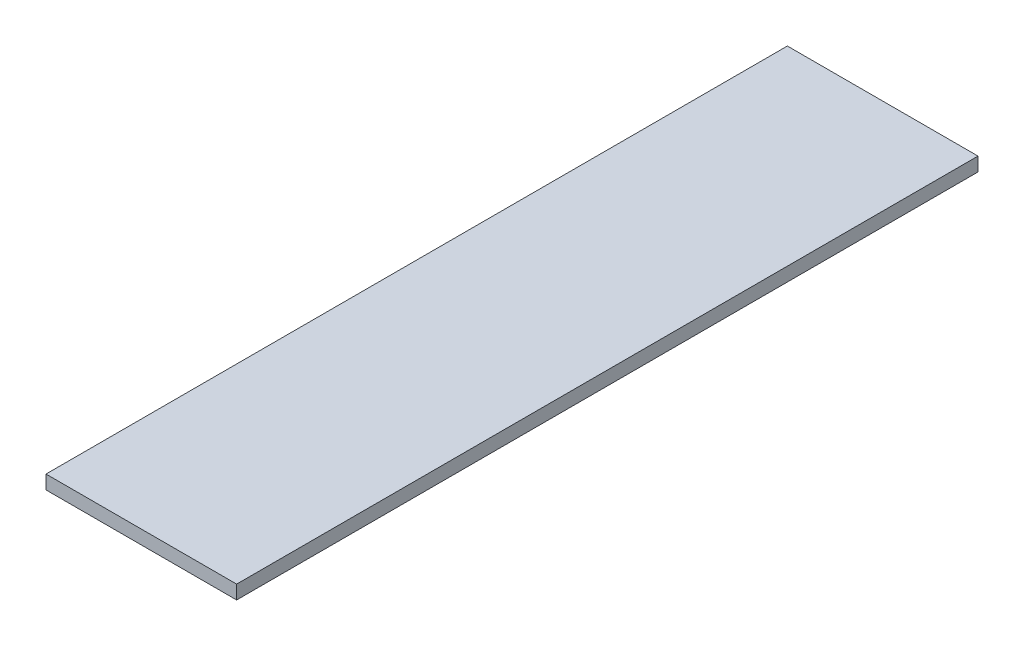
ISO-10303-21;
HEADER;
FILE_DESCRIPTION(('STEP AP214'),'2;1');
FILE_NAME('part.step','',(''),(''),'','','');
FILE_SCHEMA(('AUTOMOTIVE_DESIGN { 1 0 10303 214 1 1 1 1 }'));
ENDSEC;
DATA;
#1=APPLICATION_CONTEXT('core data for automotive mechanical design processes');
#2=APPLICATION_PROTOCOL_DEFINITION('international standard','automotive_design',2000,#1);
#3=PRODUCT_CONTEXT('',#1,'mechanical');
#4=PRODUCT('Part','Part','',(#3));
#5=PRODUCT_RELATED_PRODUCT_CATEGORY('part','',(#4));
#6=PRODUCT_DEFINITION_FORMATION('','',#4);
#7=PRODUCT_DEFINITION_CONTEXT('part definition',#1,'design');
#8=PRODUCT_DEFINITION('design','',#6,#7);
#9=PRODUCT_DEFINITION_SHAPE('','',#8);
#10=(LENGTH_UNIT() NAMED_UNIT(*) SI_UNIT(.MILLI.,.METRE.));
#11=(NAMED_UNIT(*) PLANE_ANGLE_UNIT() SI_UNIT($,.RADIAN.));
#12=(NAMED_UNIT(*) SI_UNIT($,.STERADIAN.) SOLID_ANGLE_UNIT());
#13=UNCERTAINTY_MEASURE_WITH_UNIT(LENGTH_MEASURE(1.E-05),#10,'distance_accuracy_value','');
#14=(GEOMETRIC_REPRESENTATION_CONTEXT(3) GLOBAL_UNCERTAINTY_ASSIGNED_CONTEXT((#13)) GLOBAL_UNIT_ASSIGNED_CONTEXT((#10,
#11,#12)) REPRESENTATION_CONTEXT('',''));
#15=CARTESIAN_POINT('',(0.,0.,0.));
#16=DIRECTION('',(0.,0.,1.));
#17=DIRECTION('',(1.,0.,0.));
#18=AXIS2_PLACEMENT_3D('',#15,#16,#17);
#19=CARTESIAN_POINT('',(-61.5441969952535,28.8120922238926,700.));
#20=DIRECTION('',(1.,0.,0.));
#21=DIRECTION('',(0.,1.,0.));
#22=AXIS2_PLACEMENT_3D('',#19,#20,#21);
#23=PLANE('',#22);
#24=DIRECTION('',(0.,-1.,0.));
#25=VECTOR('',#24,1.);
#26=CARTESIAN_POINT('',(-61.5441969952535,28.8120922238926,0.));
#27=LINE('',#26,#25);
#28=CARTESIAN_POINT('',(-61.5441969952535,28.8120922238926,0.));
#29=VERTEX_POINT('',#28);
#30=CARTESIAN_POINT('',(-61.5441969952535,15.8120922238926,0.));
#31=VERTEX_POINT('',#30);
#32=EDGE_CURVE('E96',#29,#31,#27,.T.);
#33=ORIENTED_EDGE('',*,*,#32,.T.);
#34=DIRECTION('',(0.,0.,-1.));
#35=VECTOR('',#34,1.);
#36=CARTESIAN_POINT('',(-61.5441969952535,15.8120922238926,700.));
#37=LINE('',#36,#35);
#38=CARTESIAN_POINT('',(-61.5441969952535,15.8120922238926,700.));
#39=VERTEX_POINT('',#38);
#40=EDGE_CURVE('E11',#39,#31,#37,.T.);
#41=ORIENTED_EDGE('',*,*,#40,.F.);
#42=DIRECTION('',(0.,-1.,0.));
#43=VECTOR('',#42,1.);
#44=CARTESIAN_POINT('',(-61.5441969952535,28.8120922238926,700.));
#45=LINE('',#44,#43);
#46=CARTESIAN_POINT('',(-61.5441969952535,28.8120922238926,700.));
#47=VERTEX_POINT('',#46);
#48=EDGE_CURVE('E84',#47,#39,#45,.T.);
#49=ORIENTED_EDGE('',*,*,#48,.F.);
#50=DIRECTION('',(0.,0.,-1.));
#51=VECTOR('',#50,1.);
#52=CARTESIAN_POINT('',(-61.5441969952535,28.8120922238926,700.));
#53=LINE('',#52,#51);
#54=EDGE_CURVE('E92',#47,#29,#53,.T.);
#55=ORIENTED_EDGE('',*,*,#54,.T.);
#56=EDGE_LOOP('',(#33,#41,#49,#55));
#57=FACE_BOUND('',#56,.T.);
#58=ADVANCED_FACE('F33',(#57),#23,.F.);
#59=CARTESIAN_POINT('',(-61.5441969952535,15.8120922238926,700.));
#60=DIRECTION('',(0.,1.,0.));
#61=DIRECTION('',(0.,0.,1.));
#62=AXIS2_PLACEMENT_3D('',#59,#60,#61);
#63=PLANE('',#62);
#64=DIRECTION('',(1.,0.,0.));
#65=VECTOR('',#64,1.);
#66=CARTESIAN_POINT('',(-61.5441969952535,15.8120922238926,0.));
#67=LINE('',#66,#65);
#68=CARTESIAN_POINT('',(118.455803004747,15.8120922238926,0.));
#69=VERTEX_POINT('',#68);
#70=EDGE_CURVE('E88',#31,#69,#67,.T.);
#71=ORIENTED_EDGE('',*,*,#70,.T.);
#72=DIRECTION('',(0.,0.,-1.));
#73=VECTOR('',#72,1.);
#74=CARTESIAN_POINT('',(118.455803004747,15.8120922238926,700.));
#75=LINE('',#74,#73);
#76=CARTESIAN_POINT('',(118.455803004747,15.8120922238926,700.));
#77=VERTEX_POINT('',#76);
#78=EDGE_CURVE('E41',#77,#69,#75,.T.);
#79=ORIENTED_EDGE('',*,*,#78,.F.);
#80=DIRECTION('',(1.,0.,0.));
#81=VECTOR('',#80,1.);
#82=CARTESIAN_POINT('',(-61.5441969952535,15.8120922238926,700.));
#83=LINE('',#82,#81);
#84=EDGE_CURVE('E79',#39,#77,#83,.T.);
#85=ORIENTED_EDGE('',*,*,#84,.F.);
#86=ORIENTED_EDGE('',*,*,#40,.T.);
#87=EDGE_LOOP('',(#71,#79,#85,#86));
#88=FACE_BOUND('',#87,.T.);
#89=ADVANCED_FACE('F87',(#88),#63,.F.);
#90=CARTESIAN_POINT('',(118.455803004747,28.8120922238926,700.));
#91=DIRECTION('',(-1.,0.,0.));
#92=DIRECTION('',(0.,-1.,0.));
#93=AXIS2_PLACEMENT_3D('',#90,#91,#92);
#94=PLANE('',#93);
#95=DIRECTION('',(0.,1.,0.));
#96=VECTOR('',#95,1.);
#97=CARTESIAN_POINT('',(118.455803004747,28.8120922238926,0.));
#98=LINE('',#97,#96);
#99=CARTESIAN_POINT('',(118.455803004747,28.8120922238926,0.));
#100=VERTEX_POINT('',#99);
#101=EDGE_CURVE('E66',#69,#100,#98,.T.);
#102=ORIENTED_EDGE('',*,*,#101,.T.);
#103=DIRECTION('',(0.,0.,-1.));
#104=VECTOR('',#103,1.);
#105=CARTESIAN_POINT('',(118.455803004747,28.8120922238926,700.));
#106=LINE('',#105,#104);
#107=CARTESIAN_POINT('',(118.455803004747,28.8120922238926,700.));
#108=VERTEX_POINT('',#107);
#109=EDGE_CURVE('E89',#108,#100,#106,.T.);
#110=ORIENTED_EDGE('',*,*,#109,.F.);
#111=DIRECTION('',(0.,1.,0.));
#112=VECTOR('',#111,1.);
#113=CARTESIAN_POINT('',(118.455803004747,28.8120922238926,700.));
#114=LINE('',#113,#112);
#115=EDGE_CURVE('E82',#77,#108,#114,.T.);
#116=ORIENTED_EDGE('',*,*,#115,.F.);
#117=ORIENTED_EDGE('',*,*,#78,.T.);
#118=EDGE_LOOP('',(#102,#110,#116,#117));
#119=FACE_BOUND('',#118,.T.);
#120=ADVANCED_FACE('F90',(#119),#94,.F.);
#121=CARTESIAN_POINT('',(-61.5441969952535,28.8120922238926,700.));
#122=DIRECTION('',(0.,-1.,0.));
#123=DIRECTION('',(0.,0.,-1.));
#124=AXIS2_PLACEMENT_3D('',#121,#122,#123);
#125=PLANE('',#124);
#126=DIRECTION('',(-1.,0.,0.));
#127=VECTOR('',#126,1.);
#128=CARTESIAN_POINT('',(-61.5441969952535,28.8120922238926,0.));
#129=LINE('',#128,#127);
#130=EDGE_CURVE('E72',#100,#29,#129,.T.);
#131=ORIENTED_EDGE('',*,*,#130,.T.);
#132=ORIENTED_EDGE('',*,*,#54,.F.);
#133=DIRECTION('',(-1.,0.,0.));
#134=VECTOR('',#133,1.);
#135=CARTESIAN_POINT('',(-61.5441969952535,28.8120922238926,700.));
#136=LINE('',#135,#134);
#137=EDGE_CURVE('E49',#108,#47,#136,.T.);
#138=ORIENTED_EDGE('',*,*,#137,.F.);
#139=ORIENTED_EDGE('',*,*,#109,.T.);
#140=EDGE_LOOP('',(#131,#132,#138,#139));
#141=FACE_BOUND('',#140,.T.);
#142=ADVANCED_FACE('F103',(#141),#125,.F.);
#143=CARTESIAN_POINT('',(0.,0.,700.));
#144=DIRECTION('',(0.,0.,1.));
#145=DIRECTION('',(1.,0.,0.));
#146=AXIS2_PLACEMENT_3D('',#143,#144,#145);
#147=PLANE('',#146);
#148=ORIENTED_EDGE('',*,*,#48,.T.);
#149=ORIENTED_EDGE('',*,*,#84,.T.);
#150=ORIENTED_EDGE('',*,*,#115,.T.);
#151=ORIENTED_EDGE('',*,*,#137,.T.);
#152=EDGE_LOOP('',(#148,#149,#150,#151));
#153=FACE_BOUND('',#152,.T.);
#154=ADVANCED_FACE('F80',(#153),#147,.T.);
#155=CARTESIAN_POINT('',(0.,0.,0.));
#156=DIRECTION('',(0.,0.,1.));
#157=DIRECTION('',(1.,0.,0.));
#158=AXIS2_PLACEMENT_3D('',#155,#156,#157);
#159=PLANE('',#158);
#160=ORIENTED_EDGE('',*,*,#32,.F.);
#161=ORIENTED_EDGE('',*,*,#130,.F.);
#162=ORIENTED_EDGE('',*,*,#101,.F.);
#163=ORIENTED_EDGE('',*,*,#70,.F.);
#164=EDGE_LOOP('',(#160,#161,#162,#163));
#165=FACE_BOUND('',#164,.T.);
#166=ADVANCED_FACE('F106',(#165),#159,.F.);
#167=CLOSED_SHELL('',(#58,#89,#120,#142,#154,#166));
#168=MANIFOLD_SOLID_BREP('B2',#167);
#169=ADVANCED_BREP_SHAPE_REPRESENTATION('',(#18,#168),#14);
#170=SHAPE_DEFINITION_REPRESENTATION(#9,#169);
ENDSEC;
END-ISO-10303-21;
